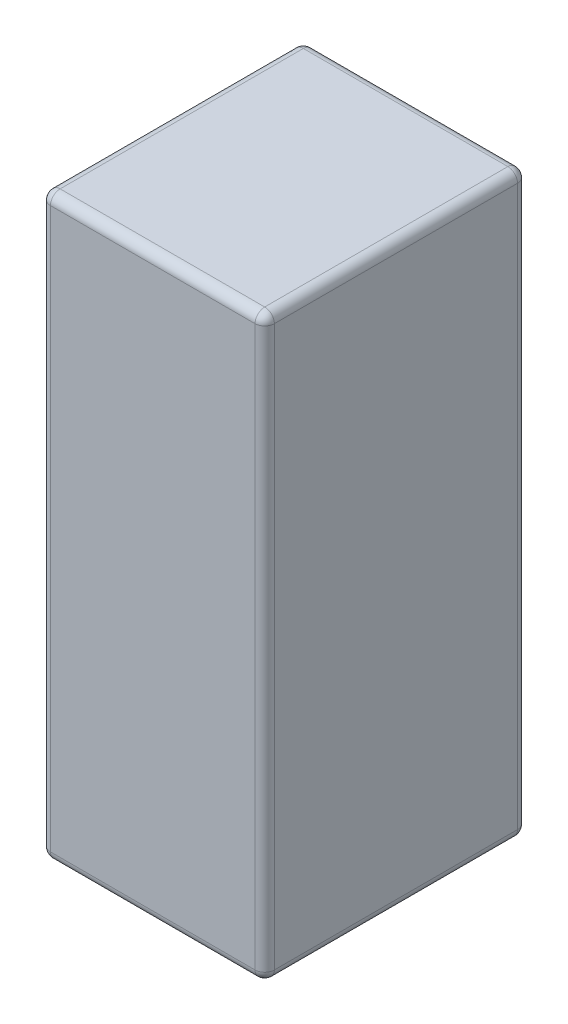
ISO-10303-21;
HEADER;
FILE_DESCRIPTION(('STEP AP214'),'2;1');
FILE_NAME('part.step','',(''),(''),'','','');
FILE_SCHEMA(('AUTOMOTIVE_DESIGN { 1 0 10303 214 1 1 1 1 }'));
ENDSEC;
DATA;
#1=APPLICATION_CONTEXT('core data for automotive mechanical design processes');
#2=APPLICATION_PROTOCOL_DEFINITION('international standard','automotive_design',2000,#1);
#3=PRODUCT_CONTEXT('',#1,'mechanical');
#4=PRODUCT('Part','Part','',(#3));
#5=PRODUCT_RELATED_PRODUCT_CATEGORY('part','',(#4));
#6=PRODUCT_DEFINITION_FORMATION('','',#4);
#7=PRODUCT_DEFINITION_CONTEXT('part definition',#1,'design');
#8=PRODUCT_DEFINITION('design','',#6,#7);
#9=PRODUCT_DEFINITION_SHAPE('','',#8);
#10=(LENGTH_UNIT() NAMED_UNIT(*) SI_UNIT(.MILLI.,.METRE.));
#11=(NAMED_UNIT(*) PLANE_ANGLE_UNIT() SI_UNIT($,.RADIAN.));
#12=(NAMED_UNIT(*) SI_UNIT($,.STERADIAN.) SOLID_ANGLE_UNIT());
#13=UNCERTAINTY_MEASURE_WITH_UNIT(LENGTH_MEASURE(1.E-05),#10,'distance_accuracy_value','');
#14=(GEOMETRIC_REPRESENTATION_CONTEXT(3) GLOBAL_UNCERTAINTY_ASSIGNED_CONTEXT((#13)) GLOBAL_UNIT_ASSIGNED_CONTEXT((#10,
#11,#12)) REPRESENTATION_CONTEXT('',''));
#15=CARTESIAN_POINT('',(0.,0.,0.));
#16=DIRECTION('',(0.,0.,1.));
#17=DIRECTION('',(1.,0.,0.));
#18=AXIS2_PLACEMENT_3D('',#15,#16,#17);
#19=CARTESIAN_POINT('',(14.5,75.,-17.));
#20=DIRECTION('',(-1.,0.,0.));
#21=DIRECTION('',(0.,0.,1.));
#22=AXIS2_PLACEMENT_3D('',#19,#20,#21);
#23=PLANE('',#22);
#24=DIRECTION('',(0.,-1.,0.));
#25=VECTOR('',#24,1.);
#26=CARTESIAN_POINT('',(14.5,75.,-15.75));
#27=LINE('',#26,#25);
#28=CARTESIAN_POINT('',(14.5,1.25,-15.75));
#29=VERTEX_POINT('',#28);
#30=CARTESIAN_POINT('',(14.5,73.75,-15.75));
#31=VERTEX_POINT('',#30);
#32=EDGE_CURVE('E177',#29,#31,#27,.F.);
#33=ORIENTED_EDGE('',*,*,#32,.T.);
#34=DIRECTION('',(0.,0.,-1.));
#35=VECTOR('',#34,1.);
#36=CARTESIAN_POINT('',(14.5,73.75,17.));
#37=LINE('',#36,#35);
#38=CARTESIAN_POINT('',(14.5,73.75,15.75));
#39=VERTEX_POINT('',#38);
#40=EDGE_CURVE('E180',#31,#39,#37,.F.);
#41=ORIENTED_EDGE('',*,*,#40,.T.);
#42=DIRECTION('',(0.,-1.,0.));
#43=VECTOR('',#42,1.);
#44=CARTESIAN_POINT('',(14.5,75.,15.75));
#45=LINE('',#44,#43);
#46=CARTESIAN_POINT('',(14.5,1.25,15.75));
#47=VERTEX_POINT('',#46);
#48=EDGE_CURVE('E175',#39,#47,#45,.T.);
#49=ORIENTED_EDGE('',*,*,#48,.T.);
#50=DIRECTION('',(0.,0.,-1.));
#51=VECTOR('',#50,1.);
#52=CARTESIAN_POINT('',(14.5,1.25,-17.));
#53=LINE('',#52,#51);
#54=EDGE_CURVE('E173',#47,#29,#53,.T.);
#55=ORIENTED_EDGE('',*,*,#54,.T.);
#56=EDGE_LOOP('',(#33,#41,#49,#55));
#57=FACE_BOUND('',#56,.T.);
#58=ADVANCED_FACE('F39',(#57),#23,.F.);
#59=CARTESIAN_POINT('',(-14.5,75.,-17.));
#60=DIRECTION('',(0.,0.,1.));
#61=DIRECTION('',(1.,0.,0.));
#62=AXIS2_PLACEMENT_3D('',#59,#60,#61);
#63=PLANE('',#62);
#64=DIRECTION('',(0.,-1.,0.));
#65=VECTOR('',#64,1.);
#66=CARTESIAN_POINT('',(-13.25,75.,-17.));
#67=LINE('',#66,#65);
#68=CARTESIAN_POINT('',(-13.25,1.25,-17.));
#69=VERTEX_POINT('',#68);
#70=CARTESIAN_POINT('',(-13.25,73.75,-17.));
#71=VERTEX_POINT('',#70);
#72=EDGE_CURVE('E135',#69,#71,#67,.F.);
#73=ORIENTED_EDGE('',*,*,#72,.T.);
#74=DIRECTION('',(-1.,0.,0.));
#75=VECTOR('',#74,1.);
#76=CARTESIAN_POINT('',(14.5,73.75,-17.));
#77=LINE('',#76,#75);
#78=CARTESIAN_POINT('',(13.25,73.75,-17.));
#79=VERTEX_POINT('',#78);
#80=EDGE_CURVE('E171',#71,#79,#77,.F.);
#81=ORIENTED_EDGE('',*,*,#80,.T.);
#82=DIRECTION('',(0.,-1.,0.));
#83=VECTOR('',#82,1.);
#84=CARTESIAN_POINT('',(13.25,75.,-17.));
#85=LINE('',#84,#83);
#86=CARTESIAN_POINT('',(13.25,1.25,-17.));
#87=VERTEX_POINT('',#86);
#88=EDGE_CURVE('E168',#79,#87,#85,.T.);
#89=ORIENTED_EDGE('',*,*,#88,.T.);
#90=DIRECTION('',(-1.,0.,0.));
#91=VECTOR('',#90,1.);
#92=CARTESIAN_POINT('',(-14.5,1.25,-17.));
#93=LINE('',#92,#91);
#94=EDGE_CURVE('E163',#87,#69,#93,.T.);
#95=ORIENTED_EDGE('',*,*,#94,.T.);
#96=EDGE_LOOP('',(#73,#81,#89,#95));
#97=FACE_BOUND('',#96,.T.);
#98=ADVANCED_FACE('F297',(#97),#63,.F.);
#99=CARTESIAN_POINT('',(-14.5,75.,-17.));
#100=DIRECTION('',(1.,0.,0.));
#101=DIRECTION('',(0.,0.,-1.));
#102=AXIS2_PLACEMENT_3D('',#99,#100,#101);
#103=PLANE('',#102);
#104=DIRECTION('',(0.,-1.,0.));
#105=VECTOR('',#104,1.);
#106=CARTESIAN_POINT('',(-14.5,75.,15.75));
#107=LINE('',#106,#105);
#108=CARTESIAN_POINT('',(-14.5,1.25,15.75));
#109=VERTEX_POINT('',#108);
#110=CARTESIAN_POINT('',(-14.5,73.75,15.75));
#111=VERTEX_POINT('',#110);
#112=EDGE_CURVE('E156',#109,#111,#107,.F.);
#113=ORIENTED_EDGE('',*,*,#112,.T.);
#114=DIRECTION('',(0.,0.,1.));
#115=VECTOR('',#114,1.);
#116=CARTESIAN_POINT('',(-14.5,73.75,-17.));
#117=LINE('',#116,#115);
#118=CARTESIAN_POINT('',(-14.5,73.75,-15.75));
#119=VERTEX_POINT('',#118);
#120=EDGE_CURVE('E160',#111,#119,#117,.F.);
#121=ORIENTED_EDGE('',*,*,#120,.T.);
#122=DIRECTION('',(0.,-1.,0.));
#123=VECTOR('',#122,1.);
#124=CARTESIAN_POINT('',(-14.5,75.,-15.75));
#125=LINE('',#124,#123);
#126=CARTESIAN_POINT('',(-14.5,1.25,-15.75));
#127=VERTEX_POINT('',#126);
#128=EDGE_CURVE('E133',#119,#127,#125,.T.);
#129=ORIENTED_EDGE('',*,*,#128,.T.);
#130=DIRECTION('',(0.,0.,1.));
#131=VECTOR('',#130,1.);
#132=CARTESIAN_POINT('',(-14.5,1.25,-17.));
#133=LINE('',#132,#131);
#134=EDGE_CURVE('E150',#127,#109,#133,.T.);
#135=ORIENTED_EDGE('',*,*,#134,.T.);
#136=EDGE_LOOP('',(#113,#121,#129,#135));
#137=FACE_BOUND('',#136,.T.);
#138=ADVANCED_FACE('F158',(#137),#103,.F.);
#139=CARTESIAN_POINT('',(-14.5,75.,17.));
#140=DIRECTION('',(0.,0.,-1.));
#141=DIRECTION('',(-1.,0.,0.));
#142=AXIS2_PLACEMENT_3D('',#139,#140,#141);
#143=PLANE('',#142);
#144=DIRECTION('',(0.,-1.,0.));
#145=VECTOR('',#144,1.);
#146=CARTESIAN_POINT('',(13.25,75.,17.));
#147=LINE('',#146,#145);
#148=CARTESIAN_POINT('',(13.25,1.25,17.));
#149=VERTEX_POINT('',#148);
#150=CARTESIAN_POINT('',(13.25,73.75,17.));
#151=VERTEX_POINT('',#150);
#152=EDGE_CURVE('E184',#149,#151,#147,.F.);
#153=ORIENTED_EDGE('',*,*,#152,.T.);
#154=DIRECTION('',(1.,0.,0.));
#155=VECTOR('',#154,1.);
#156=CARTESIAN_POINT('',(-14.5,73.75,17.));
#157=LINE('',#156,#155);
#158=CARTESIAN_POINT('',(-13.25,73.75,17.));
#159=VERTEX_POINT('',#158);
#160=EDGE_CURVE('E189',#151,#159,#157,.F.);
#161=ORIENTED_EDGE('',*,*,#160,.T.);
#162=DIRECTION('',(0.,-1.,0.));
#163=VECTOR('',#162,1.);
#164=CARTESIAN_POINT('',(-13.25,75.,17.));
#165=LINE('',#164,#163);
#166=CARTESIAN_POINT('',(-13.25,1.25,17.));
#167=VERTEX_POINT('',#166);
#168=EDGE_CURVE('E186',#159,#167,#165,.T.);
#169=ORIENTED_EDGE('',*,*,#168,.T.);
#170=DIRECTION('',(1.,0.,0.));
#171=VECTOR('',#170,1.);
#172=CARTESIAN_POINT('',(-14.5,1.25,17.));
#173=LINE('',#172,#171);
#174=EDGE_CURVE('E182',#167,#149,#173,.T.);
#175=ORIENTED_EDGE('',*,*,#174,.T.);
#176=EDGE_LOOP('',(#153,#161,#169,#175));
#177=FACE_BOUND('',#176,.T.);
#178=ADVANCED_FACE('F320',(#177),#143,.F.);
#179=CARTESIAN_POINT('',(0.,75.,0.));
#180=DIRECTION('',(0.,1.,0.));
#181=DIRECTION('',(0.,0.,1.));
#182=AXIS2_PLACEMENT_3D('',#179,#180,#181);
#183=PLANE('',#182);
#184=DIRECTION('',(0.,0.,1.));
#185=VECTOR('',#184,1.);
#186=CARTESIAN_POINT('',(-13.25,75.,17.));
#187=LINE('',#186,#185);
#188=CARTESIAN_POINT('',(-13.25,75.,-15.75));
#189=VERTEX_POINT('',#188);
#190=CARTESIAN_POINT('',(-13.25,75.,15.75));
#191=VERTEX_POINT('',#190);
#192=EDGE_CURVE('E195',#189,#191,#187,.T.);
#193=ORIENTED_EDGE('',*,*,#192,.T.);
#194=DIRECTION('',(1.,0.,0.));
#195=VECTOR('',#194,1.);
#196=CARTESIAN_POINT('',(14.5,75.,15.75));
#197=LINE('',#196,#195);
#198=CARTESIAN_POINT('',(13.25,75.,15.75));
#199=VERTEX_POINT('',#198);
#200=EDGE_CURVE('E197',#191,#199,#197,.T.);
#201=ORIENTED_EDGE('',*,*,#200,.T.);
#202=DIRECTION('',(0.,0.,-1.));
#203=VECTOR('',#202,1.);
#204=CARTESIAN_POINT('',(13.25,75.,-17.));
#205=LINE('',#204,#203);
#206=CARTESIAN_POINT('',(13.25,75.,-15.75));
#207=VERTEX_POINT('',#206);
#208=EDGE_CURVE('E191',#199,#207,#205,.T.);
#209=ORIENTED_EDGE('',*,*,#208,.T.);
#210=DIRECTION('',(-1.,0.,0.));
#211=VECTOR('',#210,1.);
#212=CARTESIAN_POINT('',(-14.5,75.,-15.75));
#213=LINE('',#212,#211);
#214=EDGE_CURVE('E193',#207,#189,#213,.T.);
#215=ORIENTED_EDGE('',*,*,#214,.T.);
#216=EDGE_LOOP('',(#193,#201,#209,#215));
#217=FACE_BOUND('',#216,.T.);
#218=ADVANCED_FACE('F275',(#217),#183,.T.);
#219=CARTESIAN_POINT('',(0.,0.,0.));
#220=DIRECTION('',(0.,1.,0.));
#221=DIRECTION('',(0.,0.,1.));
#222=AXIS2_PLACEMENT_3D('',#219,#220,#221);
#223=PLANE('',#222);
#224=DIRECTION('',(0.,0.,1.));
#225=VECTOR('',#224,1.);
#226=CARTESIAN_POINT('',(-13.25,0.,0.));
#227=LINE('',#226,#225);
#228=CARTESIAN_POINT('',(-13.25,0.,15.75));
#229=VERTEX_POINT('',#228);
#230=CARTESIAN_POINT('',(-13.25,0.,-15.75));
#231=VERTEX_POINT('',#230);
#232=EDGE_CURVE('E48',#229,#231,#227,.F.);
#233=ORIENTED_EDGE('',*,*,#232,.T.);
#234=DIRECTION('',(-1.,0.,0.));
#235=VECTOR('',#234,1.);
#236=CARTESIAN_POINT('',(0.,0.,-15.75));
#237=LINE('',#236,#235);
#238=CARTESIAN_POINT('',(13.25,0.,-15.75));
#239=VERTEX_POINT('',#238);
#240=EDGE_CURVE('E11',#231,#239,#237,.F.);
#241=ORIENTED_EDGE('',*,*,#240,.T.);
#242=DIRECTION('',(0.,0.,-1.));
#243=VECTOR('',#242,1.);
#244=CARTESIAN_POINT('',(13.25,0.,0.));
#245=LINE('',#244,#243);
#246=CARTESIAN_POINT('',(13.25,0.,15.75));
#247=VERTEX_POINT('',#246);
#248=EDGE_CURVE('E200',#239,#247,#245,.F.);
#249=ORIENTED_EDGE('',*,*,#248,.T.);
#250=DIRECTION('',(1.,0.,0.));
#251=VECTOR('',#250,1.);
#252=CARTESIAN_POINT('',(0.,0.,15.75));
#253=LINE('',#252,#251);
#254=EDGE_CURVE('E59',#247,#229,#253,.F.);
#255=ORIENTED_EDGE('',*,*,#254,.T.);
#256=EDGE_LOOP('',(#233,#241,#249,#255));
#257=FACE_BOUND('',#256,.T.);
#258=ADVANCED_FACE('F303',(#257),#223,.F.);
#259=CARTESIAN_POINT('',(13.25,75.,15.75));
#260=DIRECTION('',(0.,-1.,0.));
#261=DIRECTION('',(0.,0.,-1.));
#262=AXIS2_PLACEMENT_3D('',#259,#260,#261);
#263=CYLINDRICAL_SURFACE('',#262,1.25);
#264=CARTESIAN_POINT('',(13.25,73.75,15.75));
#265=DIRECTION('',(0.,1.,0.));
#266=DIRECTION('',(0.,0.,1.));
#267=AXIS2_PLACEMENT_3D('',#264,#265,#266);
#268=CIRCLE('',#267,1.25);
#269=EDGE_CURVE('E43',#151,#39,#268,.T.);
#270=ORIENTED_EDGE('',*,*,#269,.F.);
#271=ORIENTED_EDGE('',*,*,#152,.F.);
#272=CARTESIAN_POINT('',(13.25,1.25,15.75));
#273=DIRECTION('',(0.,-1.,0.));
#274=DIRECTION('',(0.,0.,-1.));
#275=AXIS2_PLACEMENT_3D('',#272,#273,#274);
#276=CIRCLE('',#275,1.25);
#277=EDGE_CURVE('E253',#47,#149,#276,.T.);
#278=ORIENTED_EDGE('',*,*,#277,.F.);
#279=ORIENTED_EDGE('',*,*,#48,.F.);
#280=EDGE_LOOP('',(#270,#271,#278,#279));
#281=FACE_BOUND('',#280,.T.);
#282=ADVANCED_FACE('F41',(#281),#263,.T.);
#283=CARTESIAN_POINT('',(13.25,73.75,15.75));
#284=DIRECTION('',(1.,0.,0.));
#285=DIRECTION('',(0.,0.,-1.));
#286=AXIS2_PLACEMENT_3D('',#283,#284,#285);
#287=SPHERICAL_SURFACE('',#286,1.25);
#288=CARTESIAN_POINT('',(13.25,73.75,15.75));
#289=DIRECTION('',(1.,0.,0.));
#290=DIRECTION('',(0.,0.,-1.));
#291=AXIS2_PLACEMENT_3D('',#288,#289,#290);
#292=CIRCLE('',#291,1.25);
#293=EDGE_CURVE('E248',#151,#199,#292,.F.);
#294=ORIENTED_EDGE('',*,*,#293,.F.);
#295=ORIENTED_EDGE('',*,*,#269,.T.);
#296=CARTESIAN_POINT('',(13.25,73.75,15.75));
#297=DIRECTION('',(0.,0.,1.));
#298=DIRECTION('',(1.,0.,0.));
#299=AXIS2_PLACEMENT_3D('',#296,#297,#298);
#300=CIRCLE('',#299,1.25);
#301=EDGE_CURVE('E251',#199,#39,#300,.F.);
#302=ORIENTED_EDGE('',*,*,#301,.F.);
#303=EDGE_LOOP('',(#294,#295,#302));
#304=FACE_BOUND('',#303,.T.);
#305=ADVANCED_FACE('F264',(#304),#287,.T.);
#306=CARTESIAN_POINT('',(13.25,1.25,15.75));
#307=DIRECTION('',(0.,0.,1.));
#308=DIRECTION('',(0.,-1.,0.));
#309=AXIS2_PLACEMENT_3D('',#306,#307,#308);
#310=SPHERICAL_SURFACE('',#309,1.25);
#311=CARTESIAN_POINT('',(13.25,1.25,15.75));
#312=DIRECTION('',(0.,0.,1.));
#313=DIRECTION('',(1.,0.,0.));
#314=AXIS2_PLACEMENT_3D('',#311,#312,#313);
#315=CIRCLE('',#314,1.25);
#316=EDGE_CURVE('E242',#47,#247,#315,.F.);
#317=ORIENTED_EDGE('',*,*,#316,.F.);
#318=ORIENTED_EDGE('',*,*,#277,.T.);
#319=CARTESIAN_POINT('',(13.25,1.25,15.75));
#320=DIRECTION('',(1.,0.,0.));
#321=DIRECTION('',(0.,0.,-1.));
#322=AXIS2_PLACEMENT_3D('',#319,#320,#321);
#323=CIRCLE('',#322,1.25);
#324=EDGE_CURVE('E245',#247,#149,#323,.F.);
#325=ORIENTED_EDGE('',*,*,#324,.F.);
#326=EDGE_LOOP('',(#317,#318,#325));
#327=FACE_BOUND('',#326,.T.);
#328=ADVANCED_FACE('F309',(#327),#310,.T.);
#329=CARTESIAN_POINT('',(13.25,73.75,0.));
#330=DIRECTION('',(0.,0.,1.));
#331=DIRECTION('',(1.,0.,0.));
#332=AXIS2_PLACEMENT_3D('',#329,#330,#331);
#333=CYLINDRICAL_SURFACE('',#332,1.25);
#334=ORIENTED_EDGE('',*,*,#301,.T.);
#335=ORIENTED_EDGE('',*,*,#40,.F.);
#336=CARTESIAN_POINT('',(13.25,73.75,-15.75));
#337=DIRECTION('',(0.,0.,-1.));
#338=DIRECTION('',(-1.,0.,0.));
#339=AXIS2_PLACEMENT_3D('',#336,#337,#338);
#340=CIRCLE('',#339,1.25);
#341=EDGE_CURVE('E237',#207,#31,#340,.T.);
#342=ORIENTED_EDGE('',*,*,#341,.F.);
#343=ORIENTED_EDGE('',*,*,#208,.F.);
#344=EDGE_LOOP('',(#334,#335,#342,#343));
#345=FACE_BOUND('',#344,.T.);
#346=ADVANCED_FACE('F271',(#345),#333,.T.);
#347=CARTESIAN_POINT('',(0.,73.75,15.75));
#348=DIRECTION('',(-1.,0.,0.));
#349=DIRECTION('',(0.,0.,1.));
#350=AXIS2_PLACEMENT_3D('',#347,#348,#349);
#351=CYLINDRICAL_SURFACE('',#350,1.25);
#352=ORIENTED_EDGE('',*,*,#293,.T.);
#353=ORIENTED_EDGE('',*,*,#200,.F.);
#354=CARTESIAN_POINT('',(-13.25,73.75,15.75));
#355=DIRECTION('',(-1.,0.,0.));
#356=DIRECTION('',(0.,0.,1.));
#357=AXIS2_PLACEMENT_3D('',#354,#355,#356);
#358=CIRCLE('',#357,1.25);
#359=EDGE_CURVE('E234',#159,#191,#358,.T.);
#360=ORIENTED_EDGE('',*,*,#359,.F.);
#361=ORIENTED_EDGE('',*,*,#160,.F.);
#362=EDGE_LOOP('',(#352,#353,#360,#361));
#363=FACE_BOUND('',#362,.T.);
#364=ADVANCED_FACE('F281',(#363),#351,.T.);
#365=CARTESIAN_POINT('',(-13.25,75.,15.75));
#366=DIRECTION('',(0.,-1.,0.));
#367=DIRECTION('',(0.,0.,-1.));
#368=AXIS2_PLACEMENT_3D('',#365,#366,#367);
#369=CYLINDRICAL_SURFACE('',#368,1.25);
#370=CARTESIAN_POINT('',(-13.25,1.25,15.75));
#371=DIRECTION('',(0.,-1.,0.));
#372=DIRECTION('',(0.,0.,-1.));
#373=AXIS2_PLACEMENT_3D('',#370,#371,#372);
#374=CIRCLE('',#373,1.25);
#375=EDGE_CURVE('E228',#167,#109,#374,.T.);
#376=ORIENTED_EDGE('',*,*,#375,.F.);
#377=ORIENTED_EDGE('',*,*,#168,.F.);
#378=CARTESIAN_POINT('',(-13.25,73.75,15.75));
#379=DIRECTION('',(0.,1.,0.));
#380=DIRECTION('',(0.,0.,1.));
#381=AXIS2_PLACEMENT_3D('',#378,#379,#380);
#382=CIRCLE('',#381,1.25);
#383=EDGE_CURVE('E231',#111,#159,#382,.T.);
#384=ORIENTED_EDGE('',*,*,#383,.F.);
#385=ORIENTED_EDGE('',*,*,#112,.F.);
#386=EDGE_LOOP('',(#376,#377,#384,#385));
#387=FACE_BOUND('',#386,.T.);
#388=ADVANCED_FACE('F318',(#387),#369,.T.);
#389=CARTESIAN_POINT('',(-14.5,1.25,15.75));
#390=DIRECTION('',(1.,0.,0.));
#391=DIRECTION('',(0.,0.,-1.));
#392=AXIS2_PLACEMENT_3D('',#389,#390,#391);
#393=CYLINDRICAL_SURFACE('',#392,1.25);
#394=ORIENTED_EDGE('',*,*,#324,.T.);
#395=ORIENTED_EDGE('',*,*,#174,.F.);
#396=CARTESIAN_POINT('',(-13.25,1.25,15.75));
#397=DIRECTION('',(-1.,0.,0.));
#398=DIRECTION('',(0.,0.,1.));
#399=AXIS2_PLACEMENT_3D('',#396,#397,#398);
#400=CIRCLE('',#399,1.25);
#401=EDGE_CURVE('E226',#229,#167,#400,.T.);
#402=ORIENTED_EDGE('',*,*,#401,.F.);
#403=ORIENTED_EDGE('',*,*,#254,.F.);
#404=EDGE_LOOP('',(#394,#395,#402,#403));
#405=FACE_BOUND('',#404,.T.);
#406=ADVANCED_FACE('F312',(#405),#393,.T.);
#407=CARTESIAN_POINT('',(13.25,1.25,-17.));
#408=DIRECTION('',(0.,0.,-1.));
#409=DIRECTION('',(-1.,0.,0.));
#410=AXIS2_PLACEMENT_3D('',#407,#408,#409);
#411=CYLINDRICAL_SURFACE('',#410,1.25);
#412=ORIENTED_EDGE('',*,*,#316,.T.);
#413=ORIENTED_EDGE('',*,*,#248,.F.);
#414=CARTESIAN_POINT('',(13.25,1.25,-15.75));
#415=DIRECTION('',(0.,0.,-1.));
#416=DIRECTION('',(-1.,0.,0.));
#417=AXIS2_PLACEMENT_3D('',#414,#415,#416);
#418=CIRCLE('',#417,1.25);
#419=EDGE_CURVE('E223',#29,#239,#418,.T.);
#420=ORIENTED_EDGE('',*,*,#419,.F.);
#421=ORIENTED_EDGE('',*,*,#54,.F.);
#422=EDGE_LOOP('',(#412,#413,#420,#421));
#423=FACE_BOUND('',#422,.T.);
#424=ADVANCED_FACE('F308',(#423),#411,.T.);
#425=CARTESIAN_POINT('',(13.25,75.,-15.75));
#426=DIRECTION('',(0.,-1.,0.));
#427=DIRECTION('',(0.,0.,-1.));
#428=AXIS2_PLACEMENT_3D('',#425,#426,#427);
#429=CYLINDRICAL_SURFACE('',#428,1.25);
#430=CARTESIAN_POINT('',(13.25,73.75,-15.75));
#431=DIRECTION('',(0.,1.,0.));
#432=DIRECTION('',(0.,0.,1.));
#433=AXIS2_PLACEMENT_3D('',#430,#431,#432);
#434=CIRCLE('',#433,1.25);
#435=EDGE_CURVE('E239',#31,#79,#434,.T.);
#436=ORIENTED_EDGE('',*,*,#435,.F.);
#437=ORIENTED_EDGE('',*,*,#32,.F.);
#438=CARTESIAN_POINT('',(13.25,1.25,-15.75));
#439=DIRECTION('',(0.,-1.,0.));
#440=DIRECTION('',(0.,0.,-1.));
#441=AXIS2_PLACEMENT_3D('',#438,#439,#440);
#442=CIRCLE('',#441,1.25);
#443=EDGE_CURVE('E220',#87,#29,#442,.T.);
#444=ORIENTED_EDGE('',*,*,#443,.F.);
#445=ORIENTED_EDGE('',*,*,#88,.F.);
#446=EDGE_LOOP('',(#436,#437,#444,#445));
#447=FACE_BOUND('',#446,.T.);
#448=ADVANCED_FACE('F325',(#447),#429,.T.);
#449=CARTESIAN_POINT('',(13.25,73.75,-15.75));
#450=DIRECTION('',(1.,0.,0.));
#451=DIRECTION('',(0.,0.,-1.));
#452=AXIS2_PLACEMENT_3D('',#449,#450,#451);
#453=SPHERICAL_SURFACE('',#452,1.25);
#454=ORIENTED_EDGE('',*,*,#341,.T.);
#455=ORIENTED_EDGE('',*,*,#435,.T.);
#456=CARTESIAN_POINT('',(13.25,73.75,-15.75));
#457=DIRECTION('',(1.,0.,0.));
#458=DIRECTION('',(0.,1.,0.));
#459=AXIS2_PLACEMENT_3D('',#456,#457,#458);
#460=CIRCLE('',#459,1.25);
#461=EDGE_CURVE('E217',#207,#79,#460,.F.);
#462=ORIENTED_EDGE('',*,*,#461,.F.);
#463=EDGE_LOOP('',(#454,#455,#462));
#464=FACE_BOUND('',#463,.T.);
#465=ADVANCED_FACE('F411',(#464),#453,.T.);
#466=CARTESIAN_POINT('',(-13.25,73.75,15.75));
#467=DIRECTION('',(0.,0.,1.));
#468=DIRECTION('',(1.,0.,0.));
#469=AXIS2_PLACEMENT_3D('',#466,#467,#468);
#470=SPHERICAL_SURFACE('',#469,1.25);
#471=ORIENTED_EDGE('',*,*,#383,.T.);
#472=ORIENTED_EDGE('',*,*,#359,.T.);
#473=CARTESIAN_POINT('',(-13.25,73.75,15.75));
#474=DIRECTION('',(0.,0.,1.));
#475=DIRECTION('',(1.,0.,0.));
#476=AXIS2_PLACEMENT_3D('',#473,#474,#475);
#477=CIRCLE('',#476,1.25);
#478=EDGE_CURVE('E214',#111,#191,#477,.F.);
#479=ORIENTED_EDGE('',*,*,#478,.F.);
#480=EDGE_LOOP('',(#471,#472,#479));
#481=FACE_BOUND('',#480,.T.);
#482=ADVANCED_FACE('F284',(#481),#470,.T.);
#483=CARTESIAN_POINT('',(-13.25,1.25,15.75));
#484=DIRECTION('',(0.,0.,1.));
#485=DIRECTION('',(0.,-1.,0.));
#486=AXIS2_PLACEMENT_3D('',#483,#484,#485);
#487=SPHERICAL_SURFACE('',#486,1.25);
#488=ORIENTED_EDGE('',*,*,#401,.T.);
#489=ORIENTED_EDGE('',*,*,#375,.T.);
#490=CARTESIAN_POINT('',(-13.25,1.25,15.75));
#491=DIRECTION('',(0.,0.,1.));
#492=DIRECTION('',(1.,0.,0.));
#493=AXIS2_PLACEMENT_3D('',#490,#491,#492);
#494=CIRCLE('',#493,1.25);
#495=EDGE_CURVE('E153',#229,#109,#494,.F.);
#496=ORIENTED_EDGE('',*,*,#495,.F.);
#497=EDGE_LOOP('',(#488,#489,#496));
#498=FACE_BOUND('',#497,.T.);
#499=ADVANCED_FACE('F315',(#498),#487,.T.);
#500=CARTESIAN_POINT('',(13.25,1.25,-15.75));
#501=DIRECTION('',(1.,0.,0.));
#502=DIRECTION('',(0.,1.,0.));
#503=AXIS2_PLACEMENT_3D('',#500,#501,#502);
#504=SPHERICAL_SURFACE('',#503,1.25);
#505=ORIENTED_EDGE('',*,*,#443,.T.);
#506=ORIENTED_EDGE('',*,*,#419,.T.);
#507=CARTESIAN_POINT('',(13.25,1.25,-15.75));
#508=DIRECTION('',(1.,0.,0.));
#509=DIRECTION('',(0.,0.,-1.));
#510=AXIS2_PLACEMENT_3D('',#507,#508,#509);
#511=CIRCLE('',#510,1.25);
#512=EDGE_CURVE('E211',#87,#239,#511,.F.);
#513=ORIENTED_EDGE('',*,*,#512,.F.);
#514=EDGE_LOOP('',(#505,#506,#513));
#515=FACE_BOUND('',#514,.T.);
#516=ADVANCED_FACE('F327',(#515),#504,.T.);
#517=CARTESIAN_POINT('',(0.,73.75,-15.75));
#518=DIRECTION('',(1.,0.,0.));
#519=DIRECTION('',(0.,0.,-1.));
#520=AXIS2_PLACEMENT_3D('',#517,#518,#519);
#521=CYLINDRICAL_SURFACE('',#520,1.25);
#522=ORIENTED_EDGE('',*,*,#461,.T.);
#523=ORIENTED_EDGE('',*,*,#80,.F.);
#524=CARTESIAN_POINT('',(-13.25,73.75,-15.75));
#525=DIRECTION('',(-1.,0.,0.));
#526=DIRECTION('',(0.,0.,1.));
#527=AXIS2_PLACEMENT_3D('',#524,#525,#526);
#528=CIRCLE('',#527,1.25);
#529=EDGE_CURVE('E208',#189,#71,#528,.T.);
#530=ORIENTED_EDGE('',*,*,#529,.F.);
#531=ORIENTED_EDGE('',*,*,#214,.F.);
#532=EDGE_LOOP('',(#522,#523,#530,#531));
#533=FACE_BOUND('',#532,.T.);
#534=ADVANCED_FACE('F294',(#533),#521,.T.);
#535=CARTESIAN_POINT('',(-13.25,73.75,0.));
#536=DIRECTION('',(0.,0.,-1.));
#537=DIRECTION('',(-1.,0.,0.));
#538=AXIS2_PLACEMENT_3D('',#535,#536,#537);
#539=CYLINDRICAL_SURFACE('',#538,1.25);
#540=ORIENTED_EDGE('',*,*,#478,.T.);
#541=ORIENTED_EDGE('',*,*,#192,.F.);
#542=CARTESIAN_POINT('',(-13.25,73.75,-15.75));
#543=DIRECTION('',(0.,0.,-1.));
#544=DIRECTION('',(-1.,0.,0.));
#545=AXIS2_PLACEMENT_3D('',#542,#543,#544);
#546=CIRCLE('',#545,1.25);
#547=EDGE_CURVE('E147',#119,#189,#546,.T.);
#548=ORIENTED_EDGE('',*,*,#547,.F.);
#549=ORIENTED_EDGE('',*,*,#120,.F.);
#550=EDGE_LOOP('',(#540,#541,#548,#549));
#551=FACE_BOUND('',#550,.T.);
#552=ADVANCED_FACE('F287',(#551),#539,.T.);
#553=CARTESIAN_POINT('',(-13.25,1.25,-17.));
#554=DIRECTION('',(0.,0.,1.));
#555=DIRECTION('',(1.,0.,0.));
#556=AXIS2_PLACEMENT_3D('',#553,#554,#555);
#557=CYLINDRICAL_SURFACE('',#556,1.25);
#558=ORIENTED_EDGE('',*,*,#495,.T.);
#559=ORIENTED_EDGE('',*,*,#134,.F.);
#560=CARTESIAN_POINT('',(-13.25,1.25,-15.75));
#561=DIRECTION('',(0.,0.,-1.));
#562=DIRECTION('',(-1.,0.,0.));
#563=AXIS2_PLACEMENT_3D('',#560,#561,#562);
#564=CIRCLE('',#563,1.25);
#565=EDGE_CURVE('E141',#231,#127,#564,.T.);
#566=ORIENTED_EDGE('',*,*,#565,.F.);
#567=ORIENTED_EDGE('',*,*,#232,.F.);
#568=EDGE_LOOP('',(#558,#559,#566,#567));
#569=FACE_BOUND('',#568,.T.);
#570=ADVANCED_FACE('F151',(#569),#557,.T.);
#571=CARTESIAN_POINT('',(-14.5,1.25,-15.75));
#572=DIRECTION('',(-1.,0.,0.));
#573=DIRECTION('',(0.,0.,1.));
#574=AXIS2_PLACEMENT_3D('',#571,#572,#573);
#575=CYLINDRICAL_SURFACE('',#574,1.25);
#576=ORIENTED_EDGE('',*,*,#512,.T.);
#577=ORIENTED_EDGE('',*,*,#240,.F.);
#578=CARTESIAN_POINT('',(-13.25,1.25,-15.75));
#579=DIRECTION('',(-1.,0.,0.));
#580=DIRECTION('',(0.,0.,1.));
#581=AXIS2_PLACEMENT_3D('',#578,#579,#580);
#582=CIRCLE('',#581,1.25);
#583=EDGE_CURVE('E145',#69,#231,#582,.T.);
#584=ORIENTED_EDGE('',*,*,#583,.F.);
#585=ORIENTED_EDGE('',*,*,#94,.F.);
#586=EDGE_LOOP('',(#576,#577,#584,#585));
#587=FACE_BOUND('',#586,.T.);
#588=ADVANCED_FACE('F301',(#587),#575,.T.);
#589=CARTESIAN_POINT('',(-13.25,73.75,-15.75));
#590=DIRECTION('',(0.,1.,0.));
#591=DIRECTION('',(0.,0.,1.));
#592=AXIS2_PLACEMENT_3D('',#589,#590,#591);
#593=SPHERICAL_SURFACE('',#592,1.25);
#594=ORIENTED_EDGE('',*,*,#547,.T.);
#595=ORIENTED_EDGE('',*,*,#529,.T.);
#596=CARTESIAN_POINT('',(-13.25,73.75,-15.75));
#597=DIRECTION('',(0.,1.,0.));
#598=DIRECTION('',(0.,0.,1.));
#599=AXIS2_PLACEMENT_3D('',#596,#597,#598);
#600=CIRCLE('',#599,1.25);
#601=EDGE_CURVE('E138',#119,#71,#600,.F.);
#602=ORIENTED_EDGE('',*,*,#601,.F.);
#603=EDGE_LOOP('',(#594,#595,#602));
#604=FACE_BOUND('',#603,.T.);
#605=ADVANCED_FACE('F291',(#604),#593,.T.);
#606=CARTESIAN_POINT('',(-13.25,1.25,-15.75));
#607=DIRECTION('',(0.,-1.,0.));
#608=DIRECTION('',(0.,0.,-1.));
#609=AXIS2_PLACEMENT_3D('',#606,#607,#608);
#610=SPHERICAL_SURFACE('',#609,1.25);
#611=ORIENTED_EDGE('',*,*,#583,.T.);
#612=ORIENTED_EDGE('',*,*,#565,.T.);
#613=CARTESIAN_POINT('',(-13.25,1.25,-15.75));
#614=DIRECTION('',(0.,-1.,0.));
#615=DIRECTION('',(0.,0.,-1.));
#616=AXIS2_PLACEMENT_3D('',#613,#614,#615);
#617=CIRCLE('',#616,1.25);
#618=EDGE_CURVE('E129',#69,#127,#617,.F.);
#619=ORIENTED_EDGE('',*,*,#618,.F.);
#620=EDGE_LOOP('',(#611,#612,#619));
#621=FACE_BOUND('',#620,.T.);
#622=ADVANCED_FACE('F143',(#621),#610,.T.);
#623=CARTESIAN_POINT('',(-13.25,75.,-15.75));
#624=DIRECTION('',(0.,-1.,0.));
#625=DIRECTION('',(0.,0.,-1.));
#626=AXIS2_PLACEMENT_3D('',#623,#624,#625);
#627=CYLINDRICAL_SURFACE('',#626,1.25);
#628=ORIENTED_EDGE('',*,*,#601,.T.);
#629=ORIENTED_EDGE('',*,*,#72,.F.);
#630=ORIENTED_EDGE('',*,*,#618,.T.);
#631=ORIENTED_EDGE('',*,*,#128,.F.);
#632=EDGE_LOOP('',(#628,#629,#630,#631));
#633=FACE_BOUND('',#632,.T.);
#634=ADVANCED_FACE('F131',(#633),#627,.T.);
#635=CLOSED_SHELL('',(#58,#98,#138,#178,#218,#258,#282,#305,#328,#346,#364,#388,#406,#424,#448,
#465,#482,#499,#516,#534,#552,#570,#588,#605,#622,#634));
#636=MANIFOLD_SOLID_BREP('B2',#635);
#637=ADVANCED_BREP_SHAPE_REPRESENTATION('',(#18,#636),#14);
#638=SHAPE_DEFINITION_REPRESENTATION(#9,#637);
ENDSEC;
END-ISO-10303-21;
